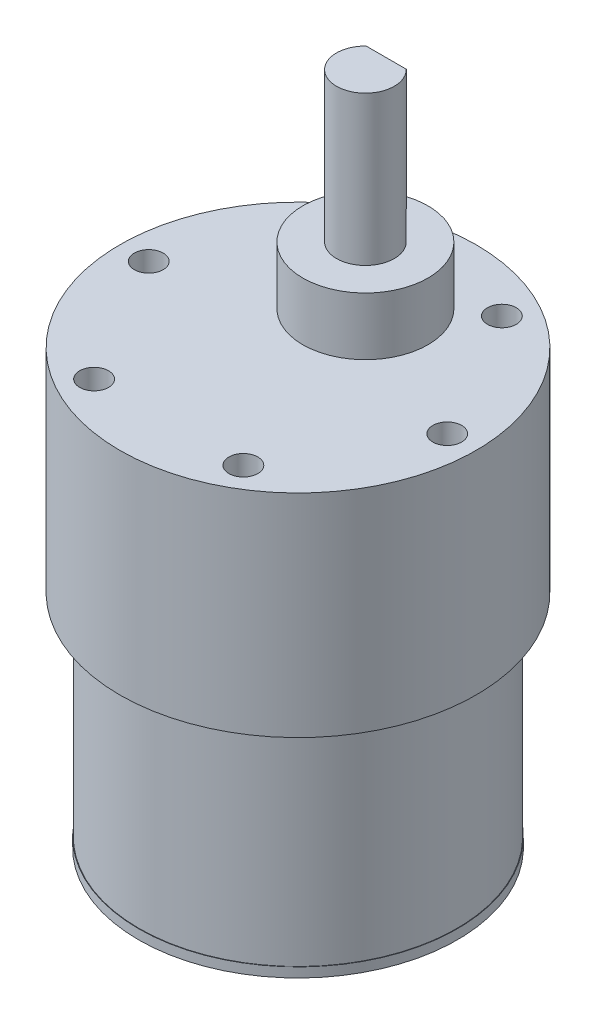
ISO-10303-21;
HEADER;
FILE_DESCRIPTION(('STEP AP214'),'2;1');
FILE_NAME('part.step','',(''),(''),'','','');
FILE_SCHEMA(('AUTOMOTIVE_DESIGN { 1 0 10303 214 1 1 1 1 }'));
ENDSEC;
DATA;
#1=APPLICATION_CONTEXT('core data for automotive mechanical design processes');
#2=APPLICATION_PROTOCOL_DEFINITION('international standard','automotive_design',2000,#1);
#3=PRODUCT_CONTEXT('',#1,'mechanical');
#4=PRODUCT('Part','Part','',(#3));
#5=PRODUCT_RELATED_PRODUCT_CATEGORY('part','',(#4));
#6=PRODUCT_DEFINITION_FORMATION('','',#4);
#7=PRODUCT_DEFINITION_CONTEXT('part definition',#1,'design');
#8=PRODUCT_DEFINITION('design','',#6,#7);
#9=PRODUCT_DEFINITION_SHAPE('','',#8);
#10=(LENGTH_UNIT() NAMED_UNIT(*) SI_UNIT(.MILLI.,.METRE.));
#11=(NAMED_UNIT(*) PLANE_ANGLE_UNIT() SI_UNIT($,.RADIAN.));
#12=(NAMED_UNIT(*) SI_UNIT($,.STERADIAN.) SOLID_ANGLE_UNIT());
#13=UNCERTAINTY_MEASURE_WITH_UNIT(LENGTH_MEASURE(1.E-05),#10,'distance_accuracy_value','');
#14=(GEOMETRIC_REPRESENTATION_CONTEXT(3) GLOBAL_UNCERTAINTY_ASSIGNED_CONTEXT((#13)) GLOBAL_UNIT_ASSIGNED_CONTEXT((#10,
#11,#12)) REPRESENTATION_CONTEXT('',''));
#15=CARTESIAN_POINT('',(0.,0.,0.));
#16=DIRECTION('',(0.,0.,1.));
#17=DIRECTION('',(1.,0.,0.));
#18=AXIS2_PLACEMENT_3D('',#15,#16,#17);
#19=CARTESIAN_POINT('',(0.,22.,0.));
#20=DIRECTION('',(0.,-1.,0.));
#21=DIRECTION('',(0.,0.,-1.));
#22=AXIS2_PLACEMENT_3D('',#19,#20,#21);
#23=CYLINDRICAL_SURFACE('',#22,18.5);
#24=CARTESIAN_POINT('',(0.,22.,0.));
#25=DIRECTION('',(0.,1.,0.));
#26=DIRECTION('',(0.,0.,1.));
#27=AXIS2_PLACEMENT_3D('',#24,#25,#26);
#28=CIRCLE('',#27,18.5);
#29=CARTESIAN_POINT('',(0.,22.,18.5));
#30=VERTEX_POINT('',#29);
#31=EDGE_CURVE('E100',#30,#30,#28,.T.);
#32=ORIENTED_EDGE('',*,*,#31,.F.);
#33=EDGE_LOOP('',(#32));
#34=FACE_BOUND('',#33,.T.);
#35=CARTESIAN_POINT('',(0.,0.,0.));
#36=DIRECTION('',(0.,1.,0.));
#37=DIRECTION('',(0.,0.,1.));
#38=AXIS2_PLACEMENT_3D('',#35,#36,#37);
#39=CIRCLE('',#38,18.5);
#40=CARTESIAN_POINT('',(0.,0.,18.5));
#41=VERTEX_POINT('',#40);
#42=EDGE_CURVE('E97',#41,#41,#39,.T.);
#43=ORIENTED_EDGE('',*,*,#42,.T.);
#44=EDGE_LOOP('',(#43));
#45=FACE_BOUND('',#44,.T.);
#46=ADVANCED_FACE('F39',(#34,#45),#23,.T.);
#47=CARTESIAN_POINT('',(0.,22.,0.));
#48=DIRECTION('',(0.,1.,0.));
#49=DIRECTION('',(0.,0.,1.));
#50=AXIS2_PLACEMENT_3D('',#47,#48,#49);
#51=PLANE('',#50);
#52=CARTESIAN_POINT('',(15.5,22.,0.));
#53=DIRECTION('',(0.,1.,0.));
#54=DIRECTION('',(0.,0.,1.));
#55=AXIS2_PLACEMENT_3D('',#52,#53,#54);
#56=CIRCLE('',#55,1.5);
#57=CARTESIAN_POINT('',(15.5,22.,1.5));
#58=VERTEX_POINT('',#57);
#59=EDGE_CURVE('E426',#58,#58,#56,.T.);
#60=ORIENTED_EDGE('',*,*,#59,.F.);
#61=EDGE_LOOP('',(#60));
#62=FACE_BOUND('',#61,.T.);
#63=CARTESIAN_POINT('',(7.75000000000016,22.,-13.4233937586587));
#64=DIRECTION('',(0.,1.,0.));
#65=DIRECTION('',(0.,0.,1.));
#66=AXIS2_PLACEMENT_3D('',#63,#64,#65);
#67=CIRCLE('',#66,1.5);
#68=CARTESIAN_POINT('',(7.75000000000016,22.,-11.9233937586587));
#69=VERTEX_POINT('',#68);
#70=EDGE_CURVE('E433',#69,#69,#67,.T.);
#71=ORIENTED_EDGE('',*,*,#70,.F.);
#72=EDGE_LOOP('',(#71));
#73=FACE_BOUND('',#72,.T.);
#74=CARTESIAN_POINT('',(-7.74999999999987,22.,-13.4233937586589));
#75=DIRECTION('',(0.,1.,0.));
#76=DIRECTION('',(0.,0.,1.));
#77=AXIS2_PLACEMENT_3D('',#74,#75,#76);
#78=CIRCLE('',#77,1.5);
#79=CARTESIAN_POINT('',(-7.74999999999987,22.,-11.9233937586589));
#80=VERTEX_POINT('',#79);
#81=EDGE_CURVE('E432',#80,#80,#78,.T.);
#82=ORIENTED_EDGE('',*,*,#81,.F.);
#83=EDGE_LOOP('',(#82));
#84=FACE_BOUND('',#83,.T.);
#85=CARTESIAN_POINT('',(-15.5,22.,-1.08235921504137E-13));
#86=DIRECTION('',(0.,1.,0.));
#87=DIRECTION('',(0.,0.,1.));
#88=AXIS2_PLACEMENT_3D('',#85,#86,#87);
#89=CIRCLE('',#88,1.5);
#90=CARTESIAN_POINT('',(-15.5,22.,1.49999999999989));
#91=VERTEX_POINT('',#90);
#92=EDGE_CURVE('E439',#91,#91,#89,.T.);
#93=ORIENTED_EDGE('',*,*,#92,.F.);
#94=EDGE_LOOP('',(#93));
#95=FACE_BOUND('',#94,.T.);
#96=CARTESIAN_POINT('',(-7.75000000000006,22.,13.4233937586588));
#97=DIRECTION('',(0.,1.,0.));
#98=DIRECTION('',(0.,0.,1.));
#99=AXIS2_PLACEMENT_3D('',#96,#97,#98);
#100=CIRCLE('',#99,1.5);
#101=CARTESIAN_POINT('',(-7.75000000000006,22.,14.9233937586588));
#102=VERTEX_POINT('',#101);
#103=EDGE_CURVE('E445',#102,#102,#100,.T.);
#104=ORIENTED_EDGE('',*,*,#103,.F.);
#105=EDGE_LOOP('',(#104));
#106=FACE_BOUND('',#105,.T.);
#107=CARTESIAN_POINT('',(7.74999999999997,22.,13.4233937586588));
#108=DIRECTION('',(0.,1.,0.));
#109=DIRECTION('',(0.,0.,1.));
#110=AXIS2_PLACEMENT_3D('',#107,#108,#109);
#111=CIRCLE('',#110,1.5);
#112=CARTESIAN_POINT('',(7.74999999999997,22.,14.9233937586588));
#113=VERTEX_POINT('',#112);
#114=EDGE_CURVE('E451',#113,#113,#111,.T.);
#115=ORIENTED_EDGE('',*,*,#114,.F.);
#116=EDGE_LOOP('',(#115));
#117=FACE_BOUND('',#116,.T.);
#118=CARTESIAN_POINT('',(0.,22.,-7.));
#119=DIRECTION('',(0.,1.,0.));
#120=DIRECTION('',(0.,0.,1.));
#121=AXIS2_PLACEMENT_3D('',#118,#119,#120);
#122=CIRCLE('',#121,6.5);
#123=CARTESIAN_POINT('',(0.,22.,-0.5));
#124=VERTEX_POINT('',#123);
#125=EDGE_CURVE('E84',#124,#124,#122,.T.);
#126=ORIENTED_EDGE('',*,*,#125,.F.);
#127=EDGE_LOOP('',(#126));
#128=FACE_BOUND('',#127,.T.);
#129=ORIENTED_EDGE('',*,*,#31,.T.);
#130=EDGE_LOOP('',(#129));
#131=FACE_BOUND('',#130,.T.);
#132=ADVANCED_FACE('F110',(#62,#73,#84,#95,#106,#117,#128,#131),#51,.T.);
#133=CARTESIAN_POINT('',(0.,0.,0.));
#134=DIRECTION('',(0.,1.,0.));
#135=DIRECTION('',(0.,0.,1.));
#136=AXIS2_PLACEMENT_3D('',#133,#134,#135);
#137=PLANE('',#136);
#138=CARTESIAN_POINT('',(0.,0.,0.));
#139=DIRECTION('',(0.,-1.,0.));
#140=DIRECTION('',(0.,0.,-1.));
#141=AXIS2_PLACEMENT_3D('',#138,#139,#140);
#142=CIRCLE('',#141,16.5);
#143=CARTESIAN_POINT('',(0.,0.,-16.5));
#144=VERTEX_POINT('',#143);
#145=EDGE_CURVE('E88',#144,#144,#142,.T.);
#146=ORIENTED_EDGE('',*,*,#145,.F.);
#147=EDGE_LOOP('',(#146));
#148=FACE_BOUND('',#147,.T.);
#149=ORIENTED_EDGE('',*,*,#42,.F.);
#150=EDGE_LOOP('',(#149));
#151=FACE_BOUND('',#150,.T.);
#152=ADVANCED_FACE('F107',(#148,#151),#137,.F.);
#153=CARTESIAN_POINT('',(0.,-22.,0.));
#154=DIRECTION('',(0.,1.,0.));
#155=DIRECTION('',(0.,0.,1.));
#156=AXIS2_PLACEMENT_3D('',#153,#154,#155);
#157=CYLINDRICAL_SURFACE('',#156,16.5);
#158=CARTESIAN_POINT('',(0.,-22.,0.));
#159=DIRECTION('',(0.,-1.,0.));
#160=DIRECTION('',(0.,0.,-1.));
#161=AXIS2_PLACEMENT_3D('',#158,#159,#160);
#162=CIRCLE('',#161,16.5);
#163=CARTESIAN_POINT('',(0.,-22.,-16.5));
#164=VERTEX_POINT('',#163);
#165=EDGE_CURVE('E92',#164,#164,#162,.T.);
#166=ORIENTED_EDGE('',*,*,#165,.F.);
#167=EDGE_LOOP('',(#166));
#168=FACE_BOUND('',#167,.T.);
#169=ORIENTED_EDGE('',*,*,#145,.T.);
#170=EDGE_LOOP('',(#169));
#171=FACE_BOUND('',#170,.T.);
#172=ADVANCED_FACE('F109',(#168,#171),#157,.T.);
#173=CARTESIAN_POINT('',(0.,-23.,0.));
#174=DIRECTION('',(0.,1.,0.));
#175=DIRECTION('',(0.,0.,1.));
#176=AXIS2_PLACEMENT_3D('',#173,#174,#175);
#177=CYLINDRICAL_SURFACE('',#176,16.55);
#178=CARTESIAN_POINT('',(0.,-23.,0.));
#179=DIRECTION('',(0.,-1.,0.));
#180=DIRECTION('',(0.,0.,-1.));
#181=AXIS2_PLACEMENT_3D('',#178,#179,#180);
#182=CIRCLE('',#181,16.55);
#183=CARTESIAN_POINT('',(0.,-23.,-16.55));
#184=VERTEX_POINT('',#183);
#185=EDGE_CURVE('E89',#184,#184,#182,.T.);
#186=ORIENTED_EDGE('',*,*,#185,.F.);
#187=EDGE_LOOP('',(#186));
#188=FACE_BOUND('',#187,.T.);
#189=CARTESIAN_POINT('',(0.,-22.,0.));
#190=DIRECTION('',(0.,-1.,0.));
#191=DIRECTION('',(0.,0.,-1.));
#192=AXIS2_PLACEMENT_3D('',#189,#190,#191);
#193=CIRCLE('',#192,16.55);
#194=CARTESIAN_POINT('',(0.,-22.,-16.55));
#195=VERTEX_POINT('',#194);
#196=EDGE_CURVE('E79',#195,#195,#193,.T.);
#197=ORIENTED_EDGE('',*,*,#196,.T.);
#198=EDGE_LOOP('',(#197));
#199=FACE_BOUND('',#198,.T.);
#200=ADVANCED_FACE('F116',(#188,#199),#177,.T.);
#201=CARTESIAN_POINT('',(0.,-23.,0.));
#202=DIRECTION('',(0.,-1.,0.));
#203=DIRECTION('',(0.,0.,-1.));
#204=AXIS2_PLACEMENT_3D('',#201,#202,#203);
#205=PLANE('',#204);
#206=ORIENTED_EDGE('',*,*,#185,.T.);
#207=EDGE_LOOP('',(#206));
#208=FACE_BOUND('',#207,.T.);
#209=ADVANCED_FACE('F347',(#208),#205,.T.);
#210=CARTESIAN_POINT('',(0.,-22.,0.));
#211=DIRECTION('',(0.,-1.,0.));
#212=DIRECTION('',(0.,0.,-1.));
#213=AXIS2_PLACEMENT_3D('',#210,#211,#212);
#214=PLANE('',#213);
#215=ORIENTED_EDGE('',*,*,#165,.T.);
#216=EDGE_LOOP('',(#215));
#217=FACE_BOUND('',#216,.T.);
#218=ORIENTED_EDGE('',*,*,#196,.F.);
#219=EDGE_LOOP('',(#218));
#220=FACE_BOUND('',#219,.T.);
#221=ADVANCED_FACE('F337',(#217,#220),#214,.F.);
#222=CARTESIAN_POINT('',(0.,28.,-7.));
#223=DIRECTION('',(0.,-1.,0.));
#224=DIRECTION('',(0.,0.,-1.));
#225=AXIS2_PLACEMENT_3D('',#222,#223,#224);
#226=CYLINDRICAL_SURFACE('',#225,6.5);
#227=CARTESIAN_POINT('',(0.,28.,-7.));
#228=DIRECTION('',(0.,1.,0.));
#229=DIRECTION('',(0.,0.,1.));
#230=AXIS2_PLACEMENT_3D('',#227,#228,#229);
#231=CIRCLE('',#230,6.5);
#232=CARTESIAN_POINT('',(0.,28.,-0.5));
#233=VERTEX_POINT('',#232);
#234=EDGE_CURVE('E76',#233,#233,#231,.T.);
#235=ORIENTED_EDGE('',*,*,#234,.F.);
#236=EDGE_LOOP('',(#235));
#237=FACE_BOUND('',#236,.T.);
#238=ORIENTED_EDGE('',*,*,#125,.T.);
#239=EDGE_LOOP('',(#238));
#240=FACE_BOUND('',#239,.T.);
#241=ADVANCED_FACE('F327',(#237,#240),#226,.T.);
#242=CARTESIAN_POINT('',(0.,28.,-7.));
#243=DIRECTION('',(0.,1.,0.));
#244=DIRECTION('',(0.,0.,1.));
#245=AXIS2_PLACEMENT_3D('',#242,#243,#244);
#246=PLANE('',#245);
#247=CARTESIAN_POINT('',(0.,28.,-7.));
#248=DIRECTION('',(0.,1.,0.));
#249=DIRECTION('',(0.,0.,1.));
#250=AXIS2_PLACEMENT_3D('',#247,#248,#249);
#251=CIRCLE('',#250,3.);
#252=CARTESIAN_POINT('',(0.,28.,-4.));
#253=VERTEX_POINT('',#252);
#254=EDGE_CURVE('E68',#253,#253,#251,.T.);
#255=ORIENTED_EDGE('',*,*,#254,.F.);
#256=EDGE_LOOP('',(#255));
#257=FACE_BOUND('',#256,.T.);
#258=ORIENTED_EDGE('',*,*,#234,.T.);
#259=EDGE_LOOP('',(#258));
#260=FACE_BOUND('',#259,.T.);
#261=ADVANCED_FACE('F318',(#257,#260),#246,.T.);
#262=CARTESIAN_POINT('',(0.,43.5,-7.));
#263=DIRECTION('',(0.,-1.,0.));
#264=DIRECTION('',(0.,0.,-1.));
#265=AXIS2_PLACEMENT_3D('',#262,#263,#264);
#266=CYLINDRICAL_SURFACE('',#265,3.);
#267=CARTESIAN_POINT('',(0.,43.5,-7.));
#268=DIRECTION('',(0.,1.,0.));
#269=DIRECTION('',(0.,0.,1.));
#270=AXIS2_PLACEMENT_3D('',#267,#268,#269);
#271=CIRCLE('',#270,3.);
#272=CARTESIAN_POINT('',(-2.0846178708337,43.5,-9.15739851038254));
#273=VERTEX_POINT('',#272);
#274=CARTESIAN_POINT('',(2.0846178708337,43.5,-9.15739851038254));
#275=VERTEX_POINT('',#274);
#276=EDGE_CURVE('E72',#273,#275,#271,.T.);
#277=ORIENTED_EDGE('',*,*,#276,.F.);
#278=DIRECTION('',(0.,-1.,0.));
#279=VECTOR('',#278,1.);
#280=CARTESIAN_POINT('',(-2.0846178708337,43.5,-9.15739851038254));
#281=LINE('',#280,#279);
#282=CARTESIAN_POINT('',(-2.0846178708337,31.5,-9.15739851038254));
#283=VERTEX_POINT('',#282);
#284=EDGE_CURVE('E53',#273,#283,#281,.T.);
#285=ORIENTED_EDGE('',*,*,#284,.T.);
#286=CARTESIAN_POINT('',(0.,31.5,-7.));
#287=DIRECTION('',(0.,-1.,0.));
#288=DIRECTION('',(0.,0.,-1.));
#289=AXIS2_PLACEMENT_3D('',#286,#287,#288);
#290=CIRCLE('',#289,3.);
#291=CARTESIAN_POINT('',(2.0846178708337,31.5,-9.15739851038254));
#292=VERTEX_POINT('',#291);
#293=EDGE_CURVE('E11',#283,#292,#290,.T.);
#294=ORIENTED_EDGE('',*,*,#293,.T.);
#295=DIRECTION('',(0.,-1.,0.));
#296=VECTOR('',#295,1.);
#297=CARTESIAN_POINT('',(2.0846178708337,43.5,-9.15739851038254));
#298=LINE('',#297,#296);
#299=EDGE_CURVE('E58',#292,#275,#298,.F.);
#300=ORIENTED_EDGE('',*,*,#299,.T.);
#301=EDGE_LOOP('',(#277,#285,#294,#300));
#302=FACE_BOUND('',#301,.T.);
#303=ORIENTED_EDGE('',*,*,#254,.T.);
#304=EDGE_LOOP('',(#303));
#305=FACE_BOUND('',#304,.T.);
#306=ADVANCED_FACE('F70',(#302,#305),#266,.T.);
#307=CARTESIAN_POINT('',(0.,43.5,-7.));
#308=DIRECTION('',(0.,1.,0.));
#309=DIRECTION('',(0.,0.,1.));
#310=AXIS2_PLACEMENT_3D('',#307,#308,#309);
#311=PLANE('',#310);
#312=DIRECTION('',(1.,0.,0.));
#313=VECTOR('',#312,1.);
#314=CARTESIAN_POINT('',(0.,43.5,-9.15739851038254));
#315=LINE('',#314,#313);
#316=EDGE_CURVE('E46',#273,#275,#315,.T.);
#317=ORIENTED_EDGE('',*,*,#316,.F.);
#318=ORIENTED_EDGE('',*,*,#276,.T.);
#319=EDGE_LOOP('',(#317,#318));
#320=FACE_BOUND('',#319,.T.);
#321=ADVANCED_FACE('F75',(#320),#311,.T.);
#322=CARTESIAN_POINT('',(0.,31.5,0.));
#323=DIRECTION('',(0.,-1.,0.));
#324=DIRECTION('',(0.,0.,-1.));
#325=AXIS2_PLACEMENT_3D('',#322,#323,#324);
#326=PLANE('',#325);
#327=DIRECTION('',(1.,0.,0.));
#328=VECTOR('',#327,1.);
#329=CARTESIAN_POINT('',(-2.0846178708337,31.5,-9.15739851038254));
#330=LINE('',#329,#328);
#331=EDGE_CURVE('E73',#283,#292,#330,.T.);
#332=ORIENTED_EDGE('',*,*,#331,.T.);
#333=ORIENTED_EDGE('',*,*,#293,.F.);
#334=EDGE_LOOP('',(#332,#333));
#335=FACE_BOUND('',#334,.T.);
#336=ADVANCED_FACE('F293',(#335),#326,.F.);
#337=CARTESIAN_POINT('',(2.28069635100429,31.5,-9.15739851038254));
#338=DIRECTION('',(0.,0.,1.));
#339=DIRECTION('',(1.,0.,0.));
#340=AXIS2_PLACEMENT_3D('',#337,#338,#339);
#341=PLANE('',#340);
#342=ORIENTED_EDGE('',*,*,#316,.T.);
#343=ORIENTED_EDGE('',*,*,#299,.F.);
#344=ORIENTED_EDGE('',*,*,#331,.F.);
#345=ORIENTED_EDGE('',*,*,#284,.F.);
#346=EDGE_LOOP('',(#342,#343,#344,#345));
#347=FACE_BOUND('',#346,.T.);
#348=ADVANCED_FACE('F64',(#347),#341,.F.);
#349=CARTESIAN_POINT('',(7.74999999999997,12.,13.4233937586588));
#350=DIRECTION('',(0.,1.,0.));
#351=DIRECTION('',(0.,0.,1.));
#352=AXIS2_PLACEMENT_3D('',#349,#350,#351);
#353=CYLINDRICAL_SURFACE('',#352,1.5);
#354=CARTESIAN_POINT('',(7.74999999999997,12.,13.4233937586588));
#355=DIRECTION('',(0.,1.,0.));
#356=DIRECTION('',(0.,0.,1.));
#357=AXIS2_PLACEMENT_3D('',#354,#355,#356);
#358=CIRCLE('',#357,1.5);
#359=CARTESIAN_POINT('',(7.74999999999997,12.,14.9233937586588));
#360=VERTEX_POINT('',#359);
#361=EDGE_CURVE('E448',#360,#360,#358,.T.);
#362=ORIENTED_EDGE('',*,*,#361,.F.);
#363=EDGE_LOOP('',(#362));
#364=FACE_BOUND('',#363,.T.);
#365=ORIENTED_EDGE('',*,*,#114,.T.);
#366=EDGE_LOOP('',(#365));
#367=FACE_BOUND('',#366,.T.);
#368=ADVANCED_FACE('F146',(#364,#367),#353,.F.);
#369=CARTESIAN_POINT('',(7.74999999999997,12.,13.4233937586588));
#370=DIRECTION('',(0.,1.,0.));
#371=DIRECTION('',(0.,0.,1.));
#372=AXIS2_PLACEMENT_3D('',#369,#370,#371);
#373=PLANE('',#372);
#374=ORIENTED_EDGE('',*,*,#361,.T.);
#375=EDGE_LOOP('',(#374));
#376=FACE_BOUND('',#375,.T.);
#377=ADVANCED_FACE('F151',(#376),#373,.T.);
#378=CARTESIAN_POINT('',(-7.75000000000006,12.,13.4233937586588));
#379=DIRECTION('',(0.,1.,0.));
#380=DIRECTION('',(0.,0.,1.));
#381=AXIS2_PLACEMENT_3D('',#378,#379,#380);
#382=CYLINDRICAL_SURFACE('',#381,1.5);
#383=CARTESIAN_POINT('',(-7.75000000000006,12.,13.4233937586588));
#384=DIRECTION('',(0.,1.,0.));
#385=DIRECTION('',(0.,0.,1.));
#386=AXIS2_PLACEMENT_3D('',#383,#384,#385);
#387=CIRCLE('',#386,1.5);
#388=CARTESIAN_POINT('',(-7.75000000000006,12.,14.9233937586588));
#389=VERTEX_POINT('',#388);
#390=EDGE_CURVE('E442',#389,#389,#387,.T.);
#391=ORIENTED_EDGE('',*,*,#390,.F.);
#392=EDGE_LOOP('',(#391));
#393=FACE_BOUND('',#392,.T.);
#394=ORIENTED_EDGE('',*,*,#103,.T.);
#395=EDGE_LOOP('',(#394));
#396=FACE_BOUND('',#395,.T.);
#397=ADVANCED_FACE('F162',(#393,#396),#382,.F.);
#398=CARTESIAN_POINT('',(-7.75000000000006,12.,13.4233937586588));
#399=DIRECTION('',(0.,1.,0.));
#400=DIRECTION('',(0.,0.,1.));
#401=AXIS2_PLACEMENT_3D('',#398,#399,#400);
#402=PLANE('',#401);
#403=ORIENTED_EDGE('',*,*,#390,.T.);
#404=EDGE_LOOP('',(#403));
#405=FACE_BOUND('',#404,.T.);
#406=ADVANCED_FACE('F173',(#405),#402,.T.);
#407=CARTESIAN_POINT('',(-15.5,12.,-1.08235921504137E-13));
#408=DIRECTION('',(0.,1.,0.));
#409=DIRECTION('',(0.,0.,1.));
#410=AXIS2_PLACEMENT_3D('',#407,#408,#409);
#411=CYLINDRICAL_SURFACE('',#410,1.5);
#412=CARTESIAN_POINT('',(-15.5,12.,-1.08235921504137E-13));
#413=DIRECTION('',(0.,1.,0.));
#414=DIRECTION('',(0.,0.,1.));
#415=AXIS2_PLACEMENT_3D('',#412,#413,#414);
#416=CIRCLE('',#415,1.5);
#417=CARTESIAN_POINT('',(-15.5,12.,1.49999999999989));
#418=VERTEX_POINT('',#417);
#419=EDGE_CURVE('E436',#418,#418,#416,.T.);
#420=ORIENTED_EDGE('',*,*,#419,.F.);
#421=EDGE_LOOP('',(#420));
#422=FACE_BOUND('',#421,.T.);
#423=ORIENTED_EDGE('',*,*,#92,.T.);
#424=EDGE_LOOP('',(#423));
#425=FACE_BOUND('',#424,.T.);
#426=ADVANCED_FACE('F184',(#422,#425),#411,.F.);
#427=CARTESIAN_POINT('',(-15.5,12.,-1.08235921504137E-13));
#428=DIRECTION('',(0.,1.,0.));
#429=DIRECTION('',(0.,0.,1.));
#430=AXIS2_PLACEMENT_3D('',#427,#428,#429);
#431=PLANE('',#430);
#432=ORIENTED_EDGE('',*,*,#419,.T.);
#433=EDGE_LOOP('',(#432));
#434=FACE_BOUND('',#433,.T.);
#435=ADVANCED_FACE('F195',(#434),#431,.T.);
#436=CARTESIAN_POINT('',(-7.74999999999987,12.,-13.4233937586589));
#437=DIRECTION('',(0.,1.,0.));
#438=DIRECTION('',(0.,0.,1.));
#439=AXIS2_PLACEMENT_3D('',#436,#437,#438);
#440=CYLINDRICAL_SURFACE('',#439,1.5);
#441=CARTESIAN_POINT('',(-7.74999999999987,12.,-13.4233937586589));
#442=DIRECTION('',(0.,1.,0.));
#443=DIRECTION('',(0.,0.,1.));
#444=AXIS2_PLACEMENT_3D('',#441,#442,#443);
#445=CIRCLE('',#444,1.5);
#446=CARTESIAN_POINT('',(-7.74999999999987,12.,-11.9233937586589));
#447=VERTEX_POINT('',#446);
#448=EDGE_CURVE('E429',#447,#447,#445,.T.);
#449=ORIENTED_EDGE('',*,*,#448,.F.);
#450=EDGE_LOOP('',(#449));
#451=FACE_BOUND('',#450,.T.);
#452=ORIENTED_EDGE('',*,*,#81,.T.);
#453=EDGE_LOOP('',(#452));
#454=FACE_BOUND('',#453,.T.);
#455=ADVANCED_FACE('F206',(#451,#454),#440,.F.);
#456=CARTESIAN_POINT('',(-7.74999999999987,12.,-13.4233937586589));
#457=DIRECTION('',(0.,1.,0.));
#458=DIRECTION('',(0.,0.,1.));
#459=AXIS2_PLACEMENT_3D('',#456,#457,#458);
#460=PLANE('',#459);
#461=ORIENTED_EDGE('',*,*,#448,.T.);
#462=EDGE_LOOP('',(#461));
#463=FACE_BOUND('',#462,.T.);
#464=ADVANCED_FACE('F217',(#463),#460,.T.);
#465=CARTESIAN_POINT('',(7.75000000000016,12.,-13.4233937586587));
#466=DIRECTION('',(0.,1.,0.));
#467=DIRECTION('',(0.,0.,1.));
#468=AXIS2_PLACEMENT_3D('',#465,#466,#467);
#469=CYLINDRICAL_SURFACE('',#468,1.5);
#470=CARTESIAN_POINT('',(7.75000000000016,12.,-13.4233937586587));
#471=DIRECTION('',(0.,1.,0.));
#472=DIRECTION('',(0.,0.,1.));
#473=AXIS2_PLACEMENT_3D('',#470,#471,#472);
#474=CIRCLE('',#473,1.5);
#475=CARTESIAN_POINT('',(7.75000000000016,12.,-11.9233937586587));
#476=VERTEX_POINT('',#475);
#477=EDGE_CURVE('E454',#476,#476,#474,.T.);
#478=ORIENTED_EDGE('',*,*,#477,.F.);
#479=EDGE_LOOP('',(#478));
#480=FACE_BOUND('',#479,.T.);
#481=ORIENTED_EDGE('',*,*,#70,.T.);
#482=EDGE_LOOP('',(#481));
#483=FACE_BOUND('',#482,.T.);
#484=ADVANCED_FACE('F228',(#480,#483),#469,.F.);
#485=CARTESIAN_POINT('',(7.75000000000016,12.,-13.4233937586587));
#486=DIRECTION('',(0.,1.,0.));
#487=DIRECTION('',(0.,0.,1.));
#488=AXIS2_PLACEMENT_3D('',#485,#486,#487);
#489=PLANE('',#488);
#490=ORIENTED_EDGE('',*,*,#477,.T.);
#491=EDGE_LOOP('',(#490));
#492=FACE_BOUND('',#491,.T.);
#493=ADVANCED_FACE('F239',(#492),#489,.T.);
#494=CARTESIAN_POINT('',(15.5,12.,0.));
#495=DIRECTION('',(0.,1.,0.));
#496=DIRECTION('',(0.,0.,1.));
#497=AXIS2_PLACEMENT_3D('',#494,#495,#496);
#498=CYLINDRICAL_SURFACE('',#497,1.5);
#499=CARTESIAN_POINT('',(15.5,12.,0.));
#500=DIRECTION('',(0.,1.,0.));
#501=DIRECTION('',(0.,0.,1.));
#502=AXIS2_PLACEMENT_3D('',#499,#500,#501);
#503=CIRCLE('',#502,1.5);
#504=CARTESIAN_POINT('',(15.5,12.,1.5));
#505=VERTEX_POINT('',#504);
#506=EDGE_CURVE('E423',#505,#505,#503,.T.);
#507=ORIENTED_EDGE('',*,*,#506,.F.);
#508=EDGE_LOOP('',(#507));
#509=FACE_BOUND('',#508,.T.);
#510=ORIENTED_EDGE('',*,*,#59,.T.);
#511=EDGE_LOOP('',(#510));
#512=FACE_BOUND('',#511,.T.);
#513=ADVANCED_FACE('F250',(#509,#512),#498,.F.);
#514=CARTESIAN_POINT('',(15.5,12.,0.));
#515=DIRECTION('',(0.,1.,0.));
#516=DIRECTION('',(0.,0.,1.));
#517=AXIS2_PLACEMENT_3D('',#514,#515,#516);
#518=PLANE('',#517);
#519=ORIENTED_EDGE('',*,*,#506,.T.);
#520=EDGE_LOOP('',(#519));
#521=FACE_BOUND('',#520,.T.);
#522=ADVANCED_FACE('F261',(#521),#518,.T.);
#523=CLOSED_SHELL('',(#46,#132,#152,#172,#200,#209,#221,#241,#261,#306,#321,#336,#348,#368,#377,
#397,#406,#426,#435,#455,#464,#484,#493,#513,#522));
#524=MANIFOLD_SOLID_BREP('B2',#523);
#525=ADVANCED_BREP_SHAPE_REPRESENTATION('',(#18,#524),#14);
#526=SHAPE_DEFINITION_REPRESENTATION(#9,#525);
ENDSEC;
END-ISO-10303-21;
